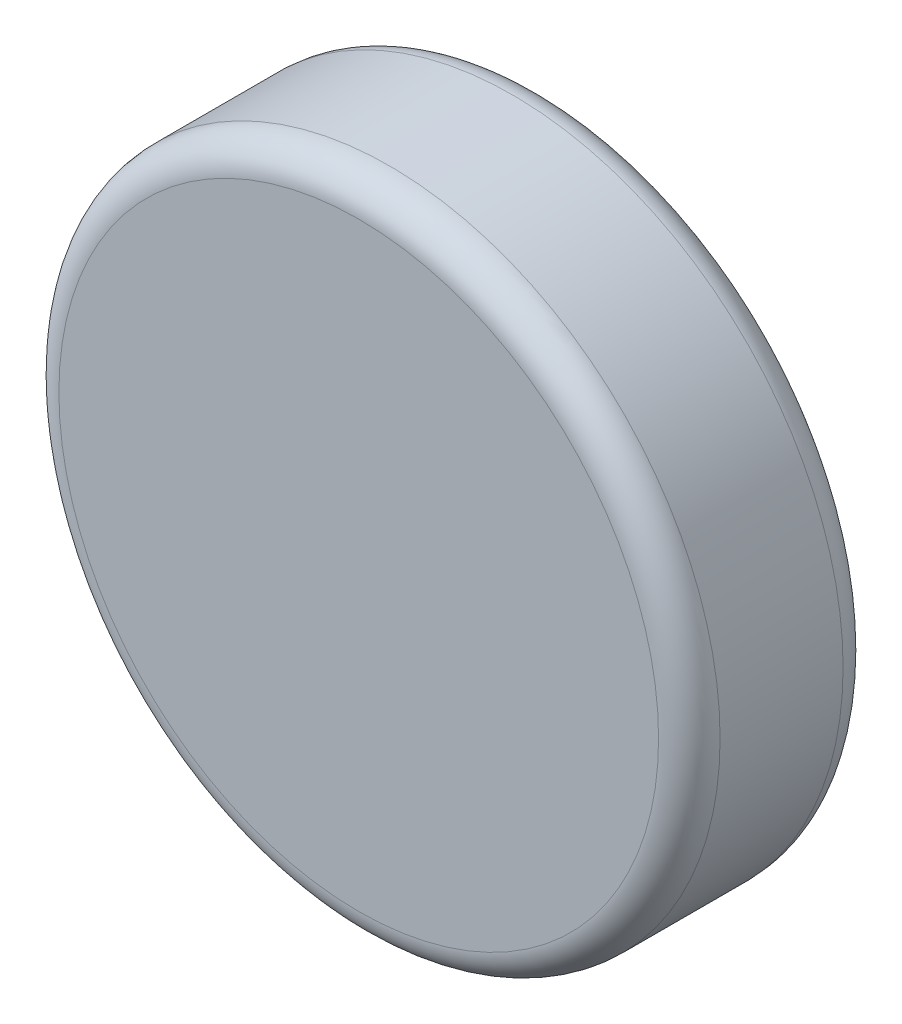
ISO-10303-21;
HEADER;
FILE_DESCRIPTION(('STEP AP214'),'2;1');
FILE_NAME('part.step','',(''),(''),'','','');
FILE_SCHEMA(('AUTOMOTIVE_DESIGN { 1 0 10303 214 1 1 1 1 }'));
ENDSEC;
DATA;
#1=APPLICATION_CONTEXT('core data for automotive mechanical design processes');
#2=APPLICATION_PROTOCOL_DEFINITION('international standard','automotive_design',2000,#1);
#3=PRODUCT_CONTEXT('',#1,'mechanical');
#4=PRODUCT('Part','Part','',(#3));
#5=PRODUCT_RELATED_PRODUCT_CATEGORY('part','',(#4));
#6=PRODUCT_DEFINITION_FORMATION('','',#4);
#7=PRODUCT_DEFINITION_CONTEXT('part definition',#1,'design');
#8=PRODUCT_DEFINITION('design','',#6,#7);
#9=PRODUCT_DEFINITION_SHAPE('','',#8);
#10=(LENGTH_UNIT() NAMED_UNIT(*) SI_UNIT(.MILLI.,.METRE.));
#11=(NAMED_UNIT(*) PLANE_ANGLE_UNIT() SI_UNIT($,.RADIAN.));
#12=(NAMED_UNIT(*) SI_UNIT($,.STERADIAN.) SOLID_ANGLE_UNIT());
#13=UNCERTAINTY_MEASURE_WITH_UNIT(LENGTH_MEASURE(1.E-05),#10,'distance_accuracy_value','');
#14=(GEOMETRIC_REPRESENTATION_CONTEXT(3) GLOBAL_UNCERTAINTY_ASSIGNED_CONTEXT((#13)) GLOBAL_UNIT_ASSIGNED_CONTEXT((#10,
#11,#12)) REPRESENTATION_CONTEXT('',''));
#15=CARTESIAN_POINT('',(0.,0.,0.));
#16=DIRECTION('',(0.,0.,1.));
#17=DIRECTION('',(1.,0.,0.));
#18=AXIS2_PLACEMENT_3D('',#15,#16,#17);
#19=CARTESIAN_POINT('',(0.,0.,6.));
#20=DIRECTION('',(0.,0.,-1.));
#21=DIRECTION('',(-1.,0.,0.));
#22=AXIS2_PLACEMENT_3D('',#19,#20,#21);
#23=CYLINDRICAL_SURFACE('',#22,10.75);
#24=CARTESIAN_POINT('',(0.,0.,5.));
#25=DIRECTION('',(0.,0.,1.));
#26=DIRECTION('',(1.,0.,0.));
#27=AXIS2_PLACEMENT_3D('',#24,#25,#26);
#28=CIRCLE('',#27,10.75);
#29=CARTESIAN_POINT('',(10.75,0.,5.));
#30=VERTEX_POINT('',#29);
#31=EDGE_CURVE('E38',#30,#30,#28,.F.);
#32=ORIENTED_EDGE('',*,*,#31,.T.);
#33=EDGE_LOOP('',(#32));
#34=FACE_BOUND('',#33,.T.);
#35=CARTESIAN_POINT('',(0.,0.,1.));
#36=DIRECTION('',(0.,0.,1.));
#37=DIRECTION('',(1.,0.,0.));
#38=AXIS2_PLACEMENT_3D('',#35,#36,#37);
#39=CIRCLE('',#38,10.75);
#40=CARTESIAN_POINT('',(10.75,0.,1.));
#41=VERTEX_POINT('',#40);
#42=EDGE_CURVE('E42',#41,#41,#39,.T.);
#43=ORIENTED_EDGE('',*,*,#42,.T.);
#44=EDGE_LOOP('',(#43));
#45=FACE_BOUND('',#44,.T.);
#46=ADVANCED_FACE('F31',(#34,#45),#23,.T.);
#47=CARTESIAN_POINT('',(0.,0.,6.));
#48=DIRECTION('',(0.,0.,1.));
#49=DIRECTION('',(1.,0.,0.));
#50=AXIS2_PLACEMENT_3D('',#47,#48,#49);
#51=PLANE('',#50);
#52=CARTESIAN_POINT('',(0.,0.,6.));
#53=DIRECTION('',(0.,0.,1.));
#54=DIRECTION('',(1.,0.,0.));
#55=AXIS2_PLACEMENT_3D('',#52,#53,#54);
#56=CIRCLE('',#55,9.75);
#57=CARTESIAN_POINT('',(9.75,0.,6.));
#58=VERTEX_POINT('',#57);
#59=EDGE_CURVE('E46',#58,#58,#56,.T.);
#60=ORIENTED_EDGE('',*,*,#59,.T.);
#61=EDGE_LOOP('',(#60));
#62=FACE_BOUND('',#61,.T.);
#63=ADVANCED_FACE('F77',(#62),#51,.T.);
#64=CARTESIAN_POINT('',(0.,0.,0.));
#65=DIRECTION('',(0.,0.,1.));
#66=DIRECTION('',(1.,0.,0.));
#67=AXIS2_PLACEMENT_3D('',#64,#65,#66);
#68=PLANE('',#67);
#69=CARTESIAN_POINT('',(0.,0.,0.));
#70=DIRECTION('',(0.,0.,1.));
#71=DIRECTION('',(1.,0.,0.));
#72=AXIS2_PLACEMENT_3D('',#69,#70,#71);
#73=CIRCLE('',#72,9.75);
#74=CARTESIAN_POINT('',(9.75,0.,0.));
#75=VERTEX_POINT('',#74);
#76=EDGE_CURVE('E10',#75,#75,#73,.F.);
#77=ORIENTED_EDGE('',*,*,#76,.T.);
#78=EDGE_LOOP('',(#77));
#79=FACE_BOUND('',#78,.T.);
#80=CARTESIAN_POINT('',(-2.5,0.,0.));
#81=DIRECTION('',(0.,0.,1.));
#82=DIRECTION('',(1.,0.,0.));
#83=AXIS2_PLACEMENT_3D('',#80,#81,#82);
#84=CIRCLE('',#83,0.7);
#85=CARTESIAN_POINT('',(-1.8,0.,0.));
#86=VERTEX_POINT('',#85);
#87=EDGE_CURVE('E51',#86,#86,#84,.F.);
#88=ORIENTED_EDGE('',*,*,#87,.F.);
#89=EDGE_LOOP('',(#88));
#90=FACE_BOUND('',#89,.T.);
#91=CARTESIAN_POINT('',(2.5,0.,0.));
#92=DIRECTION('',(0.,0.,1.));
#93=DIRECTION('',(1.,0.,0.));
#94=AXIS2_PLACEMENT_3D('',#91,#92,#93);
#95=CIRCLE('',#94,0.7);
#96=CARTESIAN_POINT('',(3.2,0.,0.));
#97=VERTEX_POINT('',#96);
#98=EDGE_CURVE('E54',#97,#97,#95,.F.);
#99=ORIENTED_EDGE('',*,*,#98,.F.);
#100=EDGE_LOOP('',(#99));
#101=FACE_BOUND('',#100,.T.);
#102=ADVANCED_FACE('F73',(#79,#90,#101),#68,.F.);
#103=CARTESIAN_POINT('',(2.5,0.,-3.));
#104=DIRECTION('',(0.,0.,1.));
#105=DIRECTION('',(1.,0.,0.));
#106=AXIS2_PLACEMENT_3D('',#103,#104,#105);
#107=CYLINDRICAL_SURFACE('',#106,0.7);
#108=CARTESIAN_POINT('',(2.5,0.,-3.));
#109=DIRECTION('',(0.,0.,-1.));
#110=DIRECTION('',(-1.,0.,0.));
#111=AXIS2_PLACEMENT_3D('',#108,#109,#110);
#112=CIRCLE('',#111,0.7);
#113=CARTESIAN_POINT('',(1.8,0.,-3.));
#114=VERTEX_POINT('',#113);
#115=EDGE_CURVE('E57',#114,#114,#112,.T.);
#116=ORIENTED_EDGE('',*,*,#115,.F.);
#117=EDGE_LOOP('',(#116));
#118=FACE_BOUND('',#117,.T.);
#119=ORIENTED_EDGE('',*,*,#98,.T.);
#120=EDGE_LOOP('',(#119));
#121=FACE_BOUND('',#120,.T.);
#122=ADVANCED_FACE('F76',(#118,#121),#107,.T.);
#123=CARTESIAN_POINT('',(2.5,0.,-3.));
#124=DIRECTION('',(0.,0.,-1.));
#125=DIRECTION('',(-1.,0.,0.));
#126=AXIS2_PLACEMENT_3D('',#123,#124,#125);
#127=PLANE('',#126);
#128=ORIENTED_EDGE('',*,*,#115,.T.);
#129=EDGE_LOOP('',(#128));
#130=FACE_BOUND('',#129,.T.);
#131=ADVANCED_FACE('F69',(#130),#127,.T.);
#132=CARTESIAN_POINT('',(-2.5,0.,-3.));
#133=DIRECTION('',(0.,0.,1.));
#134=DIRECTION('',(1.,0.,0.));
#135=AXIS2_PLACEMENT_3D('',#132,#133,#134);
#136=CYLINDRICAL_SURFACE('',#135,0.7);
#137=CARTESIAN_POINT('',(-2.5,0.,-3.));
#138=DIRECTION('',(0.,0.,-1.));
#139=DIRECTION('',(-1.,0.,0.));
#140=AXIS2_PLACEMENT_3D('',#137,#138,#139);
#141=CIRCLE('',#140,0.7);
#142=CARTESIAN_POINT('',(-3.2,0.,-3.));
#143=VERTEX_POINT('',#142);
#144=EDGE_CURVE('E60',#143,#143,#141,.T.);
#145=ORIENTED_EDGE('',*,*,#144,.F.);
#146=EDGE_LOOP('',(#145));
#147=FACE_BOUND('',#146,.T.);
#148=ORIENTED_EDGE('',*,*,#87,.T.);
#149=EDGE_LOOP('',(#148));
#150=FACE_BOUND('',#149,.T.);
#151=ADVANCED_FACE('F66',(#147,#150),#136,.T.);
#152=CARTESIAN_POINT('',(-2.5,0.,-3.));
#153=DIRECTION('',(0.,0.,-1.));
#154=DIRECTION('',(-1.,0.,0.));
#155=AXIS2_PLACEMENT_3D('',#152,#153,#154);
#156=PLANE('',#155);
#157=ORIENTED_EDGE('',*,*,#144,.T.);
#158=EDGE_LOOP('',(#157));
#159=FACE_BOUND('',#158,.T.);
#160=ADVANCED_FACE('F64',(#159),#156,.T.);
#161=CARTESIAN_POINT('',(0.,0.,5.));
#162=DIRECTION('',(0.,0.,1.));
#163=DIRECTION('',(1.,0.,0.));
#164=AXIS2_PLACEMENT_3D('',#161,#162,#163);
#165=TOROIDAL_SURFACE('',#164,9.75,1.);
#166=ORIENTED_EDGE('',*,*,#31,.F.);
#167=EDGE_LOOP('',(#166));
#168=FACE_BOUND('',#167,.T.);
#169=ORIENTED_EDGE('',*,*,#59,.F.);
#170=EDGE_LOOP('',(#169));
#171=FACE_BOUND('',#170,.T.);
#172=ADVANCED_FACE('F100',(#168,#171),#165,.T.);
#173=CARTESIAN_POINT('',(0.,0.,1.));
#174=DIRECTION('',(0.,0.,1.));
#175=DIRECTION('',(1.,0.,0.));
#176=AXIS2_PLACEMENT_3D('',#173,#174,#175);
#177=TOROIDAL_SURFACE('',#176,9.75,1.);
#178=ORIENTED_EDGE('',*,*,#76,.F.);
#179=EDGE_LOOP('',(#178));
#180=FACE_BOUND('',#179,.T.);
#181=ORIENTED_EDGE('',*,*,#42,.F.);
#182=EDGE_LOOP('',(#181));
#183=FACE_BOUND('',#182,.T.);
#184=ADVANCED_FACE('F33',(#180,#183),#177,.T.);
#185=CLOSED_SHELL('',(#46,#63,#102,#122,#131,#151,#160,#172,#184));
#186=MANIFOLD_SOLID_BREP('B2',#185);
#187=ADVANCED_BREP_SHAPE_REPRESENTATION('',(#18,#186),#14);
#188=SHAPE_DEFINITION_REPRESENTATION(#9,#187);
ENDSEC;
END-ISO-10303-21;
